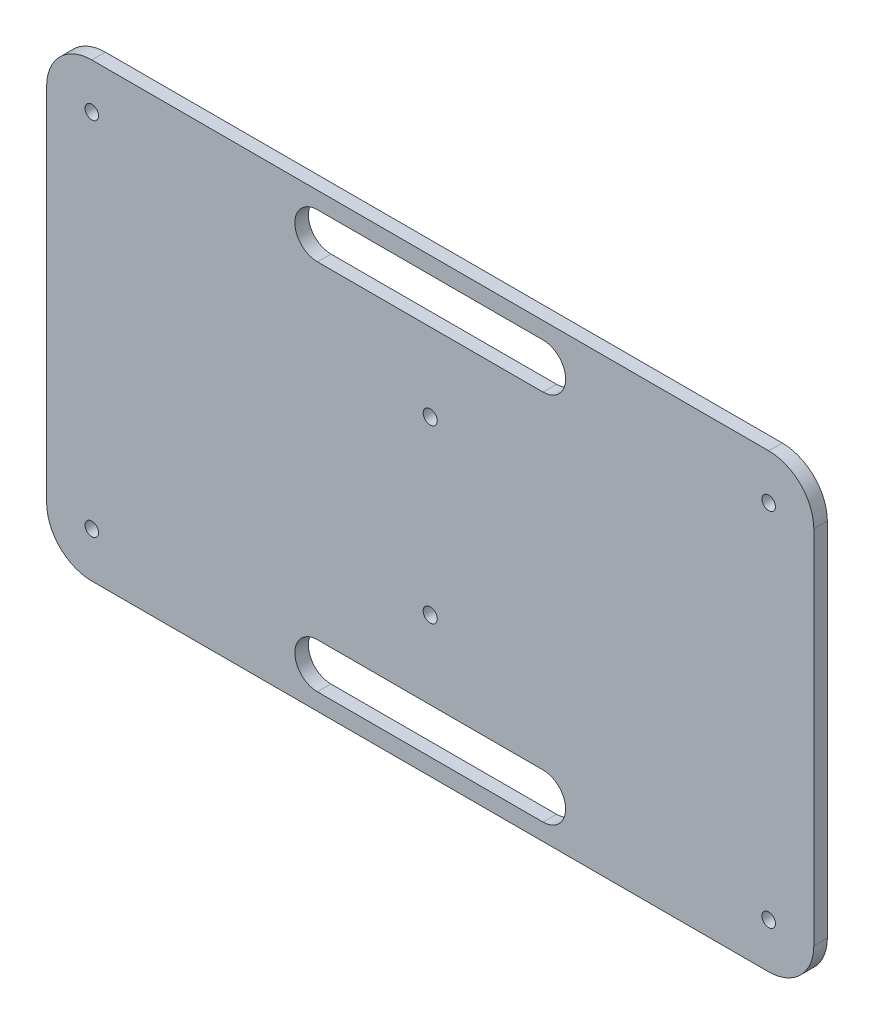
ISO-10303-21;
HEADER;
FILE_DESCRIPTION(('STEP AP214'),'2;1');
FILE_NAME('part.step','',(''),(''),'','','');
FILE_SCHEMA(('AUTOMOTIVE_DESIGN { 1 0 10303 214 1 1 1 1 }'));
ENDSEC;
DATA;
#1=APPLICATION_CONTEXT('core data for automotive mechanical design processes');
#2=APPLICATION_PROTOCOL_DEFINITION('international standard','automotive_design',2000,#1);
#3=PRODUCT_CONTEXT('',#1,'mechanical');
#4=PRODUCT('Part','Part','',(#3));
#5=PRODUCT_RELATED_PRODUCT_CATEGORY('part','',(#4));
#6=PRODUCT_DEFINITION_FORMATION('','',#4);
#7=PRODUCT_DEFINITION_CONTEXT('part definition',#1,'design');
#8=PRODUCT_DEFINITION('design','',#6,#7);
#9=PRODUCT_DEFINITION_SHAPE('','',#8);
#10=(LENGTH_UNIT() NAMED_UNIT(*) SI_UNIT(.MILLI.,.METRE.));
#11=(NAMED_UNIT(*) PLANE_ANGLE_UNIT() SI_UNIT($,.RADIAN.));
#12=(NAMED_UNIT(*) SI_UNIT($,.STERADIAN.) SOLID_ANGLE_UNIT());
#13=UNCERTAINTY_MEASURE_WITH_UNIT(LENGTH_MEASURE(1.E-05),#10,'distance_accuracy_value','');
#14=(GEOMETRIC_REPRESENTATION_CONTEXT(3) GLOBAL_UNCERTAINTY_ASSIGNED_CONTEXT((#13)) GLOBAL_UNIT_ASSIGNED_CONTEXT((#10,
#11,#12)) REPRESENTATION_CONTEXT('',''));
#15=CARTESIAN_POINT('',(0.,0.,0.));
#16=DIRECTION('',(0.,0.,1.));
#17=DIRECTION('',(1.,0.,0.));
#18=AXIS2_PLACEMENT_3D('',#15,#16,#17);
#19=CARTESIAN_POINT('',(75.,40.,3.));
#20=DIRECTION('',(0.,0.,-1.));
#21=DIRECTION('',(-1.,0.,0.));
#22=AXIS2_PLACEMENT_3D('',#19,#20,#21);
#23=PLANE('',#22);
#24=CARTESIAN_POINT('',(-25.,41.2578299056687,3.));
#25=DIRECTION('',(0.,0.,1.));
#26=DIRECTION('',(1.,0.,0.));
#27=AXIS2_PLACEMENT_3D('',#24,#25,#26);
#28=CIRCLE('',#27,5.00000000000002);
#29=CARTESIAN_POINT('',(-25.,46.2578299056687,3.));
#30=VERTEX_POINT('',#29);
#31=CARTESIAN_POINT('',(-25.,36.2578299056687,3.));
#32=VERTEX_POINT('',#31);
#33=EDGE_CURVE('E184',#30,#32,#28,.T.);
#34=ORIENTED_EDGE('',*,*,#33,.F.);
#35=DIRECTION('',(-1.,0.,0.));
#36=VECTOR('',#35,1.);
#37=CARTESIAN_POINT('',(-25.,46.2578299056687,3.));
#38=LINE('',#37,#36);
#39=CARTESIAN_POINT('',(25.,46.2578299056687,3.));
#40=VERTEX_POINT('',#39);
#41=EDGE_CURVE('E192',#40,#30,#38,.T.);
#42=ORIENTED_EDGE('',*,*,#41,.F.);
#43=CARTESIAN_POINT('',(25.,41.2578299056687,3.));
#44=DIRECTION('',(0.,0.,1.));
#45=DIRECTION('',(1.,0.,0.));
#46=AXIS2_PLACEMENT_3D('',#43,#44,#45);
#47=CIRCLE('',#46,5.00000000000002);
#48=CARTESIAN_POINT('',(25.,36.2578299056687,3.));
#49=VERTEX_POINT('',#48);
#50=EDGE_CURVE('E189',#49,#40,#47,.T.);
#51=ORIENTED_EDGE('',*,*,#50,.F.);
#52=DIRECTION('',(1.,0.,0.));
#53=VECTOR('',#52,1.);
#54=CARTESIAN_POINT('',(-25.,36.2578299056687,3.));
#55=LINE('',#54,#53);
#56=EDGE_CURVE('E186',#32,#49,#55,.T.);
#57=ORIENTED_EDGE('',*,*,#56,.F.);
#58=EDGE_LOOP('',(#34,#42,#51,#57));
#59=FACE_BOUND('',#58,.T.);
#60=CARTESIAN_POINT('',(75.,40.,3.));
#61=DIRECTION('',(0.,0.,1.));
#62=DIRECTION('',(-1.,0.,0.));
#63=AXIS2_PLACEMENT_3D('',#60,#61,#62);
#64=CIRCLE('',#63,10.);
#65=CARTESIAN_POINT('',(85.,39.9999999999999,3.));
#66=VERTEX_POINT('',#65);
#67=CARTESIAN_POINT('',(74.9999999999999,50.,3.));
#68=VERTEX_POINT('',#67);
#69=EDGE_CURVE('E215',#66,#68,#64,.T.);
#70=ORIENTED_EDGE('',*,*,#69,.T.);
#71=DIRECTION('',(-1.,0.,0.));
#72=VECTOR('',#71,1.);
#73=CARTESIAN_POINT('',(-74.9999999999999,50.,3.));
#74=LINE('',#73,#72);
#75=CARTESIAN_POINT('',(-74.9999999999999,50.,3.));
#76=VERTEX_POINT('',#75);
#77=EDGE_CURVE('E218',#68,#76,#74,.T.);
#78=ORIENTED_EDGE('',*,*,#77,.T.);
#79=CARTESIAN_POINT('',(-75.,40.,3.));
#80=DIRECTION('',(0.,0.,1.));
#81=DIRECTION('',(1.,0.,0.));
#82=AXIS2_PLACEMENT_3D('',#79,#80,#81);
#83=CIRCLE('',#82,10.);
#84=CARTESIAN_POINT('',(-85.,39.9999999999999,3.));
#85=VERTEX_POINT('',#84);
#86=EDGE_CURVE('E221',#76,#85,#83,.T.);
#87=ORIENTED_EDGE('',*,*,#86,.T.);
#88=DIRECTION('',(0.,-1.,0.));
#89=VECTOR('',#88,1.);
#90=CARTESIAN_POINT('',(-85.,39.9999999999999,3.));
#91=LINE('',#90,#89);
#92=CARTESIAN_POINT('',(-85.,-39.9999999999999,3.));
#93=VERTEX_POINT('',#92);
#94=EDGE_CURVE('E223',#85,#93,#91,.T.);
#95=ORIENTED_EDGE('',*,*,#94,.T.);
#96=CARTESIAN_POINT('',(-75.,-40.,3.));
#97=DIRECTION('',(0.,0.,1.));
#98=DIRECTION('',(-1.,0.,0.));
#99=AXIS2_PLACEMENT_3D('',#96,#97,#98);
#100=CIRCLE('',#99,10.);
#101=CARTESIAN_POINT('',(-74.9999999999999,-50.,3.));
#102=VERTEX_POINT('',#101);
#103=EDGE_CURVE('E225',#93,#102,#100,.T.);
#104=ORIENTED_EDGE('',*,*,#103,.T.);
#105=DIRECTION('',(1.,0.,0.));
#106=VECTOR('',#105,1.);
#107=CARTESIAN_POINT('',(-74.9999999999999,-50.,3.));
#108=LINE('',#107,#106);
#109=CARTESIAN_POINT('',(74.9999999999999,-50.,3.));
#110=VERTEX_POINT('',#109);
#111=EDGE_CURVE('E227',#102,#110,#108,.T.);
#112=ORIENTED_EDGE('',*,*,#111,.T.);
#113=CARTESIAN_POINT('',(75.,-40.,3.));
#114=DIRECTION('',(0.,0.,1.));
#115=DIRECTION('',(-1.,0.,0.));
#116=AXIS2_PLACEMENT_3D('',#113,#114,#115);
#117=CIRCLE('',#116,10.);
#118=CARTESIAN_POINT('',(85.,-39.9999999999999,3.));
#119=VERTEX_POINT('',#118);
#120=EDGE_CURVE('E229',#110,#119,#117,.T.);
#121=ORIENTED_EDGE('',*,*,#120,.T.);
#122=DIRECTION('',(0.,1.,0.));
#123=VECTOR('',#122,1.);
#124=CARTESIAN_POINT('',(85.,39.9999999999999,3.));
#125=LINE('',#124,#123);
#126=EDGE_CURVE('E231',#119,#66,#125,.T.);
#127=ORIENTED_EDGE('',*,*,#126,.T.);
#128=EDGE_LOOP('',(#70,#78,#87,#95,#104,#112,#121,#127));
#129=FACE_BOUND('',#128,.T.);
#130=CARTESIAN_POINT('',(-25.,-41.2578299056687,3.));
#131=DIRECTION('',(0.,0.,1.));
#132=DIRECTION('',(-1.,0.,0.));
#133=AXIS2_PLACEMENT_3D('',#130,#131,#132);
#134=CIRCLE('',#133,5.00000000000002);
#135=CARTESIAN_POINT('',(-25.,-36.2578299056687,3.));
#136=VERTEX_POINT('',#135);
#137=CARTESIAN_POINT('',(-25.,-46.2578299056687,3.));
#138=VERTEX_POINT('',#137);
#139=EDGE_CURVE('E145',#136,#138,#134,.T.);
#140=ORIENTED_EDGE('',*,*,#139,.F.);
#141=DIRECTION('',(-1.,0.,0.));
#142=VECTOR('',#141,1.);
#143=CARTESIAN_POINT('',(-25.,-36.2578299056687,3.));
#144=LINE('',#143,#142);
#145=CARTESIAN_POINT('',(25.,-36.2578299056687,3.));
#146=VERTEX_POINT('',#145);
#147=EDGE_CURVE('E168',#146,#136,#144,.T.);
#148=ORIENTED_EDGE('',*,*,#147,.F.);
#149=CARTESIAN_POINT('',(25.,-41.2578299056687,3.));
#150=DIRECTION('',(0.,0.,1.));
#151=DIRECTION('',(-1.,0.,0.));
#152=AXIS2_PLACEMENT_3D('',#149,#150,#151);
#153=CIRCLE('',#152,5.00000000000002);
#154=CARTESIAN_POINT('',(25.,-46.2578299056687,3.));
#155=VERTEX_POINT('',#154);
#156=EDGE_CURVE('E166',#155,#146,#153,.T.);
#157=ORIENTED_EDGE('',*,*,#156,.F.);
#158=DIRECTION('',(1.,0.,0.));
#159=VECTOR('',#158,1.);
#160=CARTESIAN_POINT('',(-25.,-46.2578299056687,3.));
#161=LINE('',#160,#159);
#162=EDGE_CURVE('E153',#138,#155,#161,.T.);
#163=ORIENTED_EDGE('',*,*,#162,.F.);
#164=EDGE_LOOP('',(#140,#148,#157,#163));
#165=FACE_BOUND('',#164,.T.);
#166=CARTESIAN_POINT('',(0.,19.,3.));
#167=DIRECTION('',(0.,0.,1.));
#168=DIRECTION('',(1.,0.,0.));
#169=AXIS2_PLACEMENT_3D('',#166,#167,#168);
#170=CIRCLE('',#169,1.56);
#171=CARTESIAN_POINT('',(1.55999999999999,19.,3.));
#172=VERTEX_POINT('',#171);
#173=EDGE_CURVE('E174',#172,#172,#170,.T.);
#174=ORIENTED_EDGE('',*,*,#173,.F.);
#175=EDGE_LOOP('',(#174));
#176=FACE_BOUND('',#175,.T.);
#177=CARTESIAN_POINT('',(0.,-19.,3.));
#178=DIRECTION('',(0.,0.,1.));
#179=DIRECTION('',(1.,0.,0.));
#180=AXIS2_PLACEMENT_3D('',#177,#178,#179);
#181=CIRCLE('',#180,1.56);
#182=CARTESIAN_POINT('',(1.56000000000001,-19.,3.));
#183=VERTEX_POINT('',#182);
#184=EDGE_CURVE('E424',#183,#183,#181,.T.);
#185=ORIENTED_EDGE('',*,*,#184,.F.);
#186=EDGE_LOOP('',(#185));
#187=FACE_BOUND('',#186,.T.);
#188=CARTESIAN_POINT('',(-75.,40.,3.));
#189=DIRECTION('',(0.,0.,1.));
#190=DIRECTION('',(1.,0.,0.));
#191=AXIS2_PLACEMENT_3D('',#188,#189,#190);
#192=CIRCLE('',#191,1.5);
#193=CARTESIAN_POINT('',(-73.5,40.,3.));
#194=VERTEX_POINT('',#193);
#195=EDGE_CURVE('E418',#194,#194,#192,.T.);
#196=ORIENTED_EDGE('',*,*,#195,.F.);
#197=EDGE_LOOP('',(#196));
#198=FACE_BOUND('',#197,.T.);
#199=CARTESIAN_POINT('',(75.,40.,3.));
#200=DIRECTION('',(0.,0.,1.));
#201=DIRECTION('',(1.,0.,0.));
#202=AXIS2_PLACEMENT_3D('',#199,#200,#201);
#203=CIRCLE('',#202,1.5);
#204=CARTESIAN_POINT('',(76.5,40.,3.));
#205=VERTEX_POINT('',#204);
#206=EDGE_CURVE('E412',#205,#205,#203,.T.);
#207=ORIENTED_EDGE('',*,*,#206,.F.);
#208=EDGE_LOOP('',(#207));
#209=FACE_BOUND('',#208,.T.);
#210=CARTESIAN_POINT('',(75.,-40.,3.));
#211=DIRECTION('',(0.,0.,1.));
#212=DIRECTION('',(1.,0.,0.));
#213=AXIS2_PLACEMENT_3D('',#210,#211,#212);
#214=CIRCLE('',#213,1.5);
#215=CARTESIAN_POINT('',(76.5,-40.,3.));
#216=VERTEX_POINT('',#215);
#217=EDGE_CURVE('E406',#216,#216,#214,.T.);
#218=ORIENTED_EDGE('',*,*,#217,.F.);
#219=EDGE_LOOP('',(#218));
#220=FACE_BOUND('',#219,.T.);
#221=CARTESIAN_POINT('',(-75.,-40.,3.));
#222=DIRECTION('',(0.,0.,1.));
#223=DIRECTION('',(1.,0.,0.));
#224=AXIS2_PLACEMENT_3D('',#221,#222,#223);
#225=CIRCLE('',#224,1.5);
#226=CARTESIAN_POINT('',(-73.5,-40.,3.));
#227=VERTEX_POINT('',#226);
#228=EDGE_CURVE('E397',#227,#227,#225,.T.);
#229=ORIENTED_EDGE('',*,*,#228,.F.);
#230=EDGE_LOOP('',(#229));
#231=FACE_BOUND('',#230,.T.);
#232=ADVANCED_FACE('F32',(#59,#129,#165,#176,#187,#198,#209,#220,#231),#23,.F.);
#233=CARTESIAN_POINT('',(75.,40.,0.));
#234=DIRECTION('',(0.,0.,-1.));
#235=DIRECTION('',(-1.,0.,0.));
#236=AXIS2_PLACEMENT_3D('',#233,#234,#235);
#237=PLANE('',#236);
#238=CARTESIAN_POINT('',(75.,-40.,0.));
#239=DIRECTION('',(0.,0.,1.));
#240=DIRECTION('',(1.,0.,0.));
#241=AXIS2_PLACEMENT_3D('',#238,#239,#240);
#242=CIRCLE('',#241,1.5);
#243=CARTESIAN_POINT('',(76.5,-40.,0.));
#244=VERTEX_POINT('',#243);
#245=EDGE_CURVE('E403',#244,#244,#242,.T.);
#246=ORIENTED_EDGE('',*,*,#245,.T.);
#247=EDGE_LOOP('',(#246));
#248=FACE_BOUND('',#247,.T.);
#249=CARTESIAN_POINT('',(-75.,40.,0.));
#250=DIRECTION('',(0.,0.,1.));
#251=DIRECTION('',(1.,0.,0.));
#252=AXIS2_PLACEMENT_3D('',#249,#250,#251);
#253=CIRCLE('',#252,1.5);
#254=CARTESIAN_POINT('',(-73.5,40.,0.));
#255=VERTEX_POINT('',#254);
#256=EDGE_CURVE('E415',#255,#255,#253,.T.);
#257=ORIENTED_EDGE('',*,*,#256,.T.);
#258=EDGE_LOOP('',(#257));
#259=FACE_BOUND('',#258,.T.);
#260=CARTESIAN_POINT('',(0.,19.,0.));
#261=DIRECTION('',(0.,0.,1.));
#262=DIRECTION('',(1.,0.,0.));
#263=AXIS2_PLACEMENT_3D('',#260,#261,#262);
#264=CIRCLE('',#263,1.56);
#265=CARTESIAN_POINT('',(1.55999999999999,19.,0.));
#266=VERTEX_POINT('',#265);
#267=EDGE_CURVE('E427',#266,#266,#264,.T.);
#268=ORIENTED_EDGE('',*,*,#267,.T.);
#269=EDGE_LOOP('',(#268));
#270=FACE_BOUND('',#269,.T.);
#271=CARTESIAN_POINT('',(75.,40.,0.));
#272=DIRECTION('',(0.,0.,1.));
#273=DIRECTION('',(-1.,0.,0.));
#274=AXIS2_PLACEMENT_3D('',#271,#272,#273);
#275=CIRCLE('',#274,10.);
#276=CARTESIAN_POINT('',(85.,39.9999999999999,0.));
#277=VERTEX_POINT('',#276);
#278=CARTESIAN_POINT('',(74.9999999999999,50.,0.));
#279=VERTEX_POINT('',#278);
#280=EDGE_CURVE('E214',#277,#279,#275,.T.);
#281=ORIENTED_EDGE('',*,*,#280,.F.);
#282=DIRECTION('',(0.,1.,0.));
#283=VECTOR('',#282,1.);
#284=CARTESIAN_POINT('',(85.,39.9999999999999,0.));
#285=LINE('',#284,#283);
#286=CARTESIAN_POINT('',(85.,-39.9999999999999,0.));
#287=VERTEX_POINT('',#286);
#288=EDGE_CURVE('E219',#287,#277,#285,.T.);
#289=ORIENTED_EDGE('',*,*,#288,.F.);
#290=CARTESIAN_POINT('',(75.,-40.,0.));
#291=DIRECTION('',(0.,0.,1.));
#292=DIRECTION('',(-1.,0.,0.));
#293=AXIS2_PLACEMENT_3D('',#290,#291,#292);
#294=CIRCLE('',#293,10.);
#295=CARTESIAN_POINT('',(74.9999999999999,-50.,0.));
#296=VERTEX_POINT('',#295);
#297=EDGE_CURVE('E246',#296,#287,#294,.T.);
#298=ORIENTED_EDGE('',*,*,#297,.F.);
#299=DIRECTION('',(1.,0.,0.));
#300=VECTOR('',#299,1.);
#301=CARTESIAN_POINT('',(-74.9999999999999,-50.,0.));
#302=LINE('',#301,#300);
#303=CARTESIAN_POINT('',(-74.9999999999999,-50.,0.));
#304=VERTEX_POINT('',#303);
#305=EDGE_CURVE('E244',#304,#296,#302,.T.);
#306=ORIENTED_EDGE('',*,*,#305,.F.);
#307=CARTESIAN_POINT('',(-75.,-40.,0.));
#308=DIRECTION('',(0.,0.,1.));
#309=DIRECTION('',(-1.,0.,0.));
#310=AXIS2_PLACEMENT_3D('',#307,#308,#309);
#311=CIRCLE('',#310,10.);
#312=CARTESIAN_POINT('',(-85.,-39.9999999999999,0.));
#313=VERTEX_POINT('',#312);
#314=EDGE_CURVE('E242',#313,#304,#311,.T.);
#315=ORIENTED_EDGE('',*,*,#314,.F.);
#316=DIRECTION('',(0.,-1.,0.));
#317=VECTOR('',#316,1.);
#318=CARTESIAN_POINT('',(-85.,39.9999999999999,0.));
#319=LINE('',#318,#317);
#320=CARTESIAN_POINT('',(-85.,39.9999999999999,0.));
#321=VERTEX_POINT('',#320);
#322=EDGE_CURVE('E240',#321,#313,#319,.T.);
#323=ORIENTED_EDGE('',*,*,#322,.F.);
#324=CARTESIAN_POINT('',(-75.,40.,0.));
#325=DIRECTION('',(0.,0.,1.));
#326=DIRECTION('',(1.,0.,0.));
#327=AXIS2_PLACEMENT_3D('',#324,#325,#326);
#328=CIRCLE('',#327,10.);
#329=CARTESIAN_POINT('',(-74.9999999999999,50.,0.));
#330=VERTEX_POINT('',#329);
#331=EDGE_CURVE('E238',#330,#321,#328,.T.);
#332=ORIENTED_EDGE('',*,*,#331,.F.);
#333=DIRECTION('',(-1.,0.,0.));
#334=VECTOR('',#333,1.);
#335=CARTESIAN_POINT('',(-74.9999999999999,50.,0.));
#336=LINE('',#335,#334);
#337=EDGE_CURVE('E236',#279,#330,#336,.T.);
#338=ORIENTED_EDGE('',*,*,#337,.F.);
#339=EDGE_LOOP('',(#281,#289,#298,#306,#315,#323,#332,#338));
#340=FACE_BOUND('',#339,.T.);
#341=DIRECTION('',(-1.,0.,0.));
#342=VECTOR('',#341,1.);
#343=CARTESIAN_POINT('',(-25.,46.2578299056687,0.));
#344=LINE('',#343,#342);
#345=CARTESIAN_POINT('',(25.,46.2578299056687,0.));
#346=VERTEX_POINT('',#345);
#347=CARTESIAN_POINT('',(-25.,46.2578299056687,0.));
#348=VERTEX_POINT('',#347);
#349=EDGE_CURVE('E187',#346,#348,#344,.T.);
#350=ORIENTED_EDGE('',*,*,#349,.T.);
#351=CARTESIAN_POINT('',(-25.,41.2578299056687,0.));
#352=DIRECTION('',(0.,0.,1.));
#353=DIRECTION('',(1.,0.,0.));
#354=AXIS2_PLACEMENT_3D('',#351,#352,#353);
#355=CIRCLE('',#354,5.00000000000002);
#356=CARTESIAN_POINT('',(-25.,36.2578299056687,0.));
#357=VERTEX_POINT('',#356);
#358=EDGE_CURVE('E161',#348,#357,#355,.T.);
#359=ORIENTED_EDGE('',*,*,#358,.T.);
#360=DIRECTION('',(1.,0.,0.));
#361=VECTOR('',#360,1.);
#362=CARTESIAN_POINT('',(-25.,36.2578299056687,0.));
#363=LINE('',#362,#361);
#364=CARTESIAN_POINT('',(25.,36.2578299056687,0.));
#365=VERTEX_POINT('',#364);
#366=EDGE_CURVE('E197',#357,#365,#363,.T.);
#367=ORIENTED_EDGE('',*,*,#366,.T.);
#368=CARTESIAN_POINT('',(25.,41.2578299056687,0.));
#369=DIRECTION('',(0.,0.,1.));
#370=DIRECTION('',(1.,0.,0.));
#371=AXIS2_PLACEMENT_3D('',#368,#369,#370);
#372=CIRCLE('',#371,5.00000000000002);
#373=EDGE_CURVE('E200',#365,#346,#372,.T.);
#374=ORIENTED_EDGE('',*,*,#373,.T.);
#375=EDGE_LOOP('',(#350,#359,#367,#374));
#376=FACE_BOUND('',#375,.T.);
#377=DIRECTION('',(-1.,0.,0.));
#378=VECTOR('',#377,1.);
#379=CARTESIAN_POINT('',(-25.,-36.2578299056687,0.));
#380=LINE('',#379,#378);
#381=CARTESIAN_POINT('',(25.,-36.2578299056687,0.));
#382=VERTEX_POINT('',#381);
#383=CARTESIAN_POINT('',(-25.,-36.2578299056687,0.));
#384=VERTEX_POINT('',#383);
#385=EDGE_CURVE('E154',#382,#384,#380,.T.);
#386=ORIENTED_EDGE('',*,*,#385,.T.);
#387=CARTESIAN_POINT('',(-25.,-41.2578299056687,0.));
#388=DIRECTION('',(0.,0.,1.));
#389=DIRECTION('',(-1.,0.,0.));
#390=AXIS2_PLACEMENT_3D('',#387,#388,#389);
#391=CIRCLE('',#390,5.00000000000002);
#392=CARTESIAN_POINT('',(-25.,-46.2578299056687,0.));
#393=VERTEX_POINT('',#392);
#394=EDGE_CURVE('E55',#384,#393,#391,.T.);
#395=ORIENTED_EDGE('',*,*,#394,.T.);
#396=DIRECTION('',(1.,0.,0.));
#397=VECTOR('',#396,1.);
#398=CARTESIAN_POINT('',(-25.,-46.2578299056687,0.));
#399=LINE('',#398,#397);
#400=CARTESIAN_POINT('',(25.,-46.2578299056687,0.));
#401=VERTEX_POINT('',#400);
#402=EDGE_CURVE('E160',#393,#401,#399,.T.);
#403=ORIENTED_EDGE('',*,*,#402,.T.);
#404=CARTESIAN_POINT('',(25.,-41.2578299056687,0.));
#405=DIRECTION('',(0.,0.,1.));
#406=DIRECTION('',(-1.,0.,0.));
#407=AXIS2_PLACEMENT_3D('',#404,#405,#406);
#408=CIRCLE('',#407,5.00000000000002);
#409=EDGE_CURVE('E176',#401,#382,#408,.T.);
#410=ORIENTED_EDGE('',*,*,#409,.T.);
#411=EDGE_LOOP('',(#386,#395,#403,#410));
#412=FACE_BOUND('',#411,.T.);
#413=CARTESIAN_POINT('',(0.,-19.,0.));
#414=DIRECTION('',(0.,0.,1.));
#415=DIRECTION('',(1.,0.,0.));
#416=AXIS2_PLACEMENT_3D('',#413,#414,#415);
#417=CIRCLE('',#416,1.56);
#418=CARTESIAN_POINT('',(1.56000000000001,-19.,0.));
#419=VERTEX_POINT('',#418);
#420=EDGE_CURVE('E421',#419,#419,#417,.T.);
#421=ORIENTED_EDGE('',*,*,#420,.T.);
#422=EDGE_LOOP('',(#421));
#423=FACE_BOUND('',#422,.T.);
#424=CARTESIAN_POINT('',(75.,40.,0.));
#425=DIRECTION('',(0.,0.,1.));
#426=DIRECTION('',(1.,0.,0.));
#427=AXIS2_PLACEMENT_3D('',#424,#425,#426);
#428=CIRCLE('',#427,1.5);
#429=CARTESIAN_POINT('',(76.5,40.,0.));
#430=VERTEX_POINT('',#429);
#431=EDGE_CURVE('E409',#430,#430,#428,.T.);
#432=ORIENTED_EDGE('',*,*,#431,.T.);
#433=EDGE_LOOP('',(#432));
#434=FACE_BOUND('',#433,.T.);
#435=CARTESIAN_POINT('',(-75.,-40.,0.));
#436=DIRECTION('',(0.,0.,1.));
#437=DIRECTION('',(1.,0.,0.));
#438=AXIS2_PLACEMENT_3D('',#435,#436,#437);
#439=CIRCLE('',#438,1.5);
#440=CARTESIAN_POINT('',(-73.5,-40.,0.));
#441=VERTEX_POINT('',#440);
#442=EDGE_CURVE('E400',#441,#441,#439,.T.);
#443=ORIENTED_EDGE('',*,*,#442,.T.);
#444=EDGE_LOOP('',(#443));
#445=FACE_BOUND('',#444,.T.);
#446=ADVANCED_FACE('F276',(#248,#259,#270,#340,#376,#412,#423,#434,#445),#237,.T.);
#447=CARTESIAN_POINT('',(75.,40.,3.));
#448=DIRECTION('',(0.,0.,-1.));
#449=DIRECTION('',(-1.,0.,0.));
#450=AXIS2_PLACEMENT_3D('',#447,#448,#449);
#451=CYLINDRICAL_SURFACE('',#450,10.);
#452=ORIENTED_EDGE('',*,*,#280,.T.);
#453=DIRECTION('',(0.,0.,-1.));
#454=VECTOR('',#453,1.);
#455=CARTESIAN_POINT('',(74.9999999999999,50.,3.));
#456=LINE('',#455,#454);
#457=EDGE_CURVE('E11',#68,#279,#456,.T.);
#458=ORIENTED_EDGE('',*,*,#457,.F.);
#459=ORIENTED_EDGE('',*,*,#69,.F.);
#460=DIRECTION('',(0.,0.,-1.));
#461=VECTOR('',#460,1.);
#462=CARTESIAN_POINT('',(85.,39.9999999999999,3.));
#463=LINE('',#462,#461);
#464=EDGE_CURVE('E233',#66,#277,#463,.T.);
#465=ORIENTED_EDGE('',*,*,#464,.T.);
#466=EDGE_LOOP('',(#452,#458,#459,#465));
#467=FACE_BOUND('',#466,.T.);
#468=ADVANCED_FACE('F34',(#467),#451,.T.);
#469=CARTESIAN_POINT('',(-74.9999999999999,50.,3.));
#470=DIRECTION('',(0.,-1.,0.));
#471=DIRECTION('',(0.,0.,-1.));
#472=AXIS2_PLACEMENT_3D('',#469,#470,#471);
#473=PLANE('',#472);
#474=ORIENTED_EDGE('',*,*,#337,.T.);
#475=DIRECTION('',(0.,0.,-1.));
#476=VECTOR('',#475,1.);
#477=CARTESIAN_POINT('',(-74.9999999999999,50.,3.));
#478=LINE('',#477,#476);
#479=EDGE_CURVE('E40',#76,#330,#478,.T.);
#480=ORIENTED_EDGE('',*,*,#479,.F.);
#481=ORIENTED_EDGE('',*,*,#77,.F.);
#482=ORIENTED_EDGE('',*,*,#457,.T.);
#483=EDGE_LOOP('',(#474,#480,#481,#482));
#484=FACE_BOUND('',#483,.T.);
#485=ADVANCED_FACE('F293',(#484),#473,.F.);
#486=CARTESIAN_POINT('',(-75.,40.,3.));
#487=DIRECTION('',(0.,0.,-1.));
#488=DIRECTION('',(-1.,0.,0.));
#489=AXIS2_PLACEMENT_3D('',#486,#487,#488);
#490=CYLINDRICAL_SURFACE('',#489,10.);
#491=ORIENTED_EDGE('',*,*,#331,.T.);
#492=DIRECTION('',(0.,0.,-1.));
#493=VECTOR('',#492,1.);
#494=CARTESIAN_POINT('',(-85.,39.9999999999999,3.));
#495=LINE('',#494,#493);
#496=EDGE_CURVE('E263',#85,#321,#495,.T.);
#497=ORIENTED_EDGE('',*,*,#496,.F.);
#498=ORIENTED_EDGE('',*,*,#86,.F.);
#499=ORIENTED_EDGE('',*,*,#479,.T.);
#500=EDGE_LOOP('',(#491,#497,#498,#499));
#501=FACE_BOUND('',#500,.T.);
#502=ADVANCED_FACE('F270',(#501),#490,.T.);
#503=CARTESIAN_POINT('',(-85.,39.9999999999999,3.));
#504=DIRECTION('',(1.,0.,0.));
#505=DIRECTION('',(0.,1.,0.));
#506=AXIS2_PLACEMENT_3D('',#503,#504,#505);
#507=PLANE('',#506);
#508=ORIENTED_EDGE('',*,*,#322,.T.);
#509=DIRECTION('',(0.,0.,-1.));
#510=VECTOR('',#509,1.);
#511=CARTESIAN_POINT('',(-85.,-39.9999999999999,3.));
#512=LINE('',#511,#510);
#513=EDGE_CURVE('E260',#93,#313,#512,.T.);
#514=ORIENTED_EDGE('',*,*,#513,.F.);
#515=ORIENTED_EDGE('',*,*,#94,.F.);
#516=ORIENTED_EDGE('',*,*,#496,.T.);
#517=EDGE_LOOP('',(#508,#514,#515,#516));
#518=FACE_BOUND('',#517,.T.);
#519=ADVANCED_FACE('F282',(#518),#507,.F.);
#520=CARTESIAN_POINT('',(-75.,-40.,3.));
#521=DIRECTION('',(0.,0.,-1.));
#522=DIRECTION('',(-1.,0.,0.));
#523=AXIS2_PLACEMENT_3D('',#520,#521,#522);
#524=CYLINDRICAL_SURFACE('',#523,10.);
#525=ORIENTED_EDGE('',*,*,#314,.T.);
#526=DIRECTION('',(0.,0.,-1.));
#527=VECTOR('',#526,1.);
#528=CARTESIAN_POINT('',(-74.9999999999999,-50.,3.));
#529=LINE('',#528,#527);
#530=EDGE_CURVE('E257',#102,#304,#529,.T.);
#531=ORIENTED_EDGE('',*,*,#530,.F.);
#532=ORIENTED_EDGE('',*,*,#103,.F.);
#533=ORIENTED_EDGE('',*,*,#513,.T.);
#534=EDGE_LOOP('',(#525,#531,#532,#533));
#535=FACE_BOUND('',#534,.T.);
#536=ADVANCED_FACE('F286',(#535),#524,.T.);
#537=CARTESIAN_POINT('',(-74.9999999999999,-50.,3.));
#538=DIRECTION('',(0.,1.,0.));
#539=DIRECTION('',(0.,0.,1.));
#540=AXIS2_PLACEMENT_3D('',#537,#538,#539);
#541=PLANE('',#540);
#542=ORIENTED_EDGE('',*,*,#305,.T.);
#543=DIRECTION('',(0.,0.,-1.));
#544=VECTOR('',#543,1.);
#545=CARTESIAN_POINT('',(74.9999999999999,-50.,3.));
#546=LINE('',#545,#544);
#547=EDGE_CURVE('E254',#110,#296,#546,.T.);
#548=ORIENTED_EDGE('',*,*,#547,.F.);
#549=ORIENTED_EDGE('',*,*,#111,.F.);
#550=ORIENTED_EDGE('',*,*,#530,.T.);
#551=EDGE_LOOP('',(#542,#548,#549,#550));
#552=FACE_BOUND('',#551,.T.);
#553=ADVANCED_FACE('F306',(#552),#541,.F.);
#554=CARTESIAN_POINT('',(75.,-40.,3.));
#555=DIRECTION('',(0.,0.,-1.));
#556=DIRECTION('',(-1.,0.,0.));
#557=AXIS2_PLACEMENT_3D('',#554,#555,#556);
#558=CYLINDRICAL_SURFACE('',#557,10.);
#559=ORIENTED_EDGE('',*,*,#297,.T.);
#560=DIRECTION('',(0.,0.,-1.));
#561=VECTOR('',#560,1.);
#562=CARTESIAN_POINT('',(85.,-39.9999999999999,3.));
#563=LINE('',#562,#561);
#564=EDGE_CURVE('E251',#119,#287,#563,.T.);
#565=ORIENTED_EDGE('',*,*,#564,.F.);
#566=ORIENTED_EDGE('',*,*,#120,.F.);
#567=ORIENTED_EDGE('',*,*,#547,.T.);
#568=EDGE_LOOP('',(#559,#565,#566,#567));
#569=FACE_BOUND('',#568,.T.);
#570=ADVANCED_FACE('F304',(#569),#558,.T.);
#571=CARTESIAN_POINT('',(85.,39.9999999999999,3.));
#572=DIRECTION('',(-1.,0.,0.));
#573=DIRECTION('',(0.,0.,1.));
#574=AXIS2_PLACEMENT_3D('',#571,#572,#573);
#575=PLANE('',#574);
#576=ORIENTED_EDGE('',*,*,#288,.T.);
#577=ORIENTED_EDGE('',*,*,#464,.F.);
#578=ORIENTED_EDGE('',*,*,#126,.F.);
#579=ORIENTED_EDGE('',*,*,#564,.T.);
#580=EDGE_LOOP('',(#576,#577,#578,#579));
#581=FACE_BOUND('',#580,.T.);
#582=ADVANCED_FACE('F299',(#581),#575,.F.);
#583=CARTESIAN_POINT('',(-25.,41.2578299056687,3.));
#584=DIRECTION('',(0.,0.,-1.));
#585=DIRECTION('',(-1.,0.,0.));
#586=AXIS2_PLACEMENT_3D('',#583,#584,#585);
#587=CYLINDRICAL_SURFACE('',#586,5.00000000000002);
#588=ORIENTED_EDGE('',*,*,#358,.F.);
#589=DIRECTION('',(0.,0.,-1.));
#590=VECTOR('',#589,1.);
#591=CARTESIAN_POINT('',(-25.,46.2578299056687,3.));
#592=LINE('',#591,#590);
#593=EDGE_CURVE('E194',#30,#348,#592,.T.);
#594=ORIENTED_EDGE('',*,*,#593,.F.);
#595=ORIENTED_EDGE('',*,*,#33,.T.);
#596=DIRECTION('',(0.,0.,-1.));
#597=VECTOR('',#596,1.);
#598=CARTESIAN_POINT('',(-25.,36.2578299056687,3.));
#599=LINE('',#598,#597);
#600=EDGE_CURVE('E211',#32,#357,#599,.T.);
#601=ORIENTED_EDGE('',*,*,#600,.T.);
#602=EDGE_LOOP('',(#588,#594,#595,#601));
#603=FACE_BOUND('',#602,.T.);
#604=ADVANCED_FACE('F325',(#603),#587,.F.);
#605=CARTESIAN_POINT('',(-25.,36.2578299056687,3.));
#606=DIRECTION('',(0.,1.,0.));
#607=DIRECTION('',(-1.,0.,0.));
#608=AXIS2_PLACEMENT_3D('',#605,#606,#607);
#609=PLANE('',#608);
#610=ORIENTED_EDGE('',*,*,#366,.F.);
#611=ORIENTED_EDGE('',*,*,#600,.F.);
#612=ORIENTED_EDGE('',*,*,#56,.T.);
#613=DIRECTION('',(0.,0.,-1.));
#614=VECTOR('',#613,1.);
#615=CARTESIAN_POINT('',(25.,36.2578299056687,3.));
#616=LINE('',#615,#614);
#617=EDGE_CURVE('E209',#49,#365,#616,.T.);
#618=ORIENTED_EDGE('',*,*,#617,.T.);
#619=EDGE_LOOP('',(#610,#611,#612,#618));
#620=FACE_BOUND('',#619,.T.);
#621=ADVANCED_FACE('F332',(#620),#609,.T.);
#622=CARTESIAN_POINT('',(25.,41.2578299056687,3.));
#623=DIRECTION('',(0.,0.,-1.));
#624=DIRECTION('',(-1.,0.,0.));
#625=AXIS2_PLACEMENT_3D('',#622,#623,#624);
#626=CYLINDRICAL_SURFACE('',#625,5.00000000000002);
#627=ORIENTED_EDGE('',*,*,#373,.F.);
#628=ORIENTED_EDGE('',*,*,#617,.F.);
#629=ORIENTED_EDGE('',*,*,#50,.T.);
#630=DIRECTION('',(0.,0.,-1.));
#631=VECTOR('',#630,1.);
#632=CARTESIAN_POINT('',(25.,46.2578299056687,3.));
#633=LINE('',#632,#631);
#634=EDGE_CURVE('E207',#40,#346,#633,.T.);
#635=ORIENTED_EDGE('',*,*,#634,.T.);
#636=EDGE_LOOP('',(#627,#628,#629,#635));
#637=FACE_BOUND('',#636,.T.);
#638=ADVANCED_FACE('F337',(#637),#626,.F.);
#639=CARTESIAN_POINT('',(-25.,46.2578299056687,3.));
#640=DIRECTION('',(0.,-1.,0.));
#641=DIRECTION('',(1.,0.,0.));
#642=AXIS2_PLACEMENT_3D('',#639,#640,#641);
#643=PLANE('',#642);
#644=ORIENTED_EDGE('',*,*,#349,.F.);
#645=ORIENTED_EDGE('',*,*,#634,.F.);
#646=ORIENTED_EDGE('',*,*,#41,.T.);
#647=ORIENTED_EDGE('',*,*,#593,.T.);
#648=EDGE_LOOP('',(#644,#645,#646,#647));
#649=FACE_BOUND('',#648,.T.);
#650=ADVANCED_FACE('F343',(#649),#643,.T.);
#651=CARTESIAN_POINT('',(-25.,-41.2578299056687,3.));
#652=DIRECTION('',(0.,0.,-1.));
#653=DIRECTION('',(-1.,0.,0.));
#654=AXIS2_PLACEMENT_3D('',#651,#652,#653);
#655=CYLINDRICAL_SURFACE('',#654,5.00000000000002);
#656=ORIENTED_EDGE('',*,*,#394,.F.);
#657=DIRECTION('',(0.,0.,-1.));
#658=VECTOR('',#657,1.);
#659=CARTESIAN_POINT('',(-25.,-36.2578299056687,3.));
#660=LINE('',#659,#658);
#661=EDGE_CURVE('E149',#136,#384,#660,.T.);
#662=ORIENTED_EDGE('',*,*,#661,.F.);
#663=ORIENTED_EDGE('',*,*,#139,.T.);
#664=DIRECTION('',(0.,0.,-1.));
#665=VECTOR('',#664,1.);
#666=CARTESIAN_POINT('',(-25.,-46.2578299056687,3.));
#667=LINE('',#666,#665);
#668=EDGE_CURVE('E148',#138,#393,#667,.T.);
#669=ORIENTED_EDGE('',*,*,#668,.T.);
#670=EDGE_LOOP('',(#656,#662,#663,#669));
#671=FACE_BOUND('',#670,.T.);
#672=ADVANCED_FACE('F147',(#671),#655,.F.);
#673=CARTESIAN_POINT('',(-25.,-46.2578299056687,3.));
#674=DIRECTION('',(0.,1.,0.));
#675=DIRECTION('',(-1.,0.,0.));
#676=AXIS2_PLACEMENT_3D('',#673,#674,#675);
#677=PLANE('',#676);
#678=ORIENTED_EDGE('',*,*,#402,.F.);
#679=ORIENTED_EDGE('',*,*,#668,.F.);
#680=ORIENTED_EDGE('',*,*,#162,.T.);
#681=DIRECTION('',(0.,0.,-1.));
#682=VECTOR('',#681,1.);
#683=CARTESIAN_POINT('',(25.,-46.2578299056687,3.));
#684=LINE('',#683,#682);
#685=EDGE_CURVE('E162',#155,#401,#684,.T.);
#686=ORIENTED_EDGE('',*,*,#685,.T.);
#687=EDGE_LOOP('',(#678,#679,#680,#686));
#688=FACE_BOUND('',#687,.T.);
#689=ADVANCED_FACE('F157',(#688),#677,.T.);
#690=CARTESIAN_POINT('',(25.,-41.2578299056687,3.));
#691=DIRECTION('',(0.,0.,-1.));
#692=DIRECTION('',(-1.,0.,0.));
#693=AXIS2_PLACEMENT_3D('',#690,#691,#692);
#694=CYLINDRICAL_SURFACE('',#693,5.00000000000002);
#695=ORIENTED_EDGE('',*,*,#409,.F.);
#696=ORIENTED_EDGE('',*,*,#685,.F.);
#697=ORIENTED_EDGE('',*,*,#156,.T.);
#698=DIRECTION('',(0.,0.,-1.));
#699=VECTOR('',#698,1.);
#700=CARTESIAN_POINT('',(25.,-36.2578299056687,3.));
#701=LINE('',#700,#699);
#702=EDGE_CURVE('E47',#146,#382,#701,.T.);
#703=ORIENTED_EDGE('',*,*,#702,.T.);
#704=EDGE_LOOP('',(#695,#696,#697,#703));
#705=FACE_BOUND('',#704,.T.);
#706=ADVANCED_FACE('F362',(#705),#694,.F.);
#707=CARTESIAN_POINT('',(-25.,-36.2578299056687,3.));
#708=DIRECTION('',(0.,-1.,0.));
#709=DIRECTION('',(1.,0.,0.));
#710=AXIS2_PLACEMENT_3D('',#707,#708,#709);
#711=PLANE('',#710);
#712=ORIENTED_EDGE('',*,*,#385,.F.);
#713=ORIENTED_EDGE('',*,*,#702,.F.);
#714=ORIENTED_EDGE('',*,*,#147,.T.);
#715=ORIENTED_EDGE('',*,*,#661,.T.);
#716=EDGE_LOOP('',(#712,#713,#714,#715));
#717=FACE_BOUND('',#716,.T.);
#718=ADVANCED_FACE('F365',(#717),#711,.T.);
#719=CARTESIAN_POINT('',(0.,19.,3.));
#720=DIRECTION('',(0.,0.,-1.));
#721=DIRECTION('',(-1.,0.,0.));
#722=AXIS2_PLACEMENT_3D('',#719,#720,#721);
#723=CYLINDRICAL_SURFACE('',#722,1.56);
#724=ORIENTED_EDGE('',*,*,#173,.T.);
#725=EDGE_LOOP('',(#724));
#726=FACE_BOUND('',#725,.T.);
#727=ORIENTED_EDGE('',*,*,#267,.F.);
#728=EDGE_LOOP('',(#727));
#729=FACE_BOUND('',#728,.T.);
#730=ADVANCED_FACE('F369',(#726,#729),#723,.F.);
#731=CARTESIAN_POINT('',(0.,-19.,3.));
#732=DIRECTION('',(0.,0.,-1.));
#733=DIRECTION('',(-1.,0.,0.));
#734=AXIS2_PLACEMENT_3D('',#731,#732,#733);
#735=CYLINDRICAL_SURFACE('',#734,1.56);
#736=ORIENTED_EDGE('',*,*,#184,.T.);
#737=EDGE_LOOP('',(#736));
#738=FACE_BOUND('',#737,.T.);
#739=ORIENTED_EDGE('',*,*,#420,.F.);
#740=EDGE_LOOP('',(#739));
#741=FACE_BOUND('',#740,.T.);
#742=ADVANCED_FACE('F372',(#738,#741),#735,.F.);
#743=CARTESIAN_POINT('',(-75.,40.,3.));
#744=DIRECTION('',(0.,0.,-1.));
#745=DIRECTION('',(-1.,0.,0.));
#746=AXIS2_PLACEMENT_3D('',#743,#744,#745);
#747=CYLINDRICAL_SURFACE('',#746,1.5);
#748=ORIENTED_EDGE('',*,*,#195,.T.);
#749=EDGE_LOOP('',(#748));
#750=FACE_BOUND('',#749,.T.);
#751=ORIENTED_EDGE('',*,*,#256,.F.);
#752=EDGE_LOOP('',(#751));
#753=FACE_BOUND('',#752,.T.);
#754=ADVANCED_FACE('F376',(#750,#753),#747,.F.);
#755=CARTESIAN_POINT('',(75.,40.,3.));
#756=DIRECTION('',(0.,0.,-1.));
#757=DIRECTION('',(-1.,0.,0.));
#758=AXIS2_PLACEMENT_3D('',#755,#756,#757);
#759=CYLINDRICAL_SURFACE('',#758,1.5);
#760=ORIENTED_EDGE('',*,*,#206,.T.);
#761=EDGE_LOOP('',(#760));
#762=FACE_BOUND('',#761,.T.);
#763=ORIENTED_EDGE('',*,*,#431,.F.);
#764=EDGE_LOOP('',(#763));
#765=FACE_BOUND('',#764,.T.);
#766=ADVANCED_FACE('F380',(#762,#765),#759,.F.);
#767=CARTESIAN_POINT('',(75.,-40.,3.));
#768=DIRECTION('',(0.,0.,-1.));
#769=DIRECTION('',(-1.,0.,0.));
#770=AXIS2_PLACEMENT_3D('',#767,#768,#769);
#771=CYLINDRICAL_SURFACE('',#770,1.5);
#772=ORIENTED_EDGE('',*,*,#217,.T.);
#773=EDGE_LOOP('',(#772));
#774=FACE_BOUND('',#773,.T.);
#775=ORIENTED_EDGE('',*,*,#245,.F.);
#776=EDGE_LOOP('',(#775));
#777=FACE_BOUND('',#776,.T.);
#778=ADVANCED_FACE('F384',(#774,#777),#771,.F.);
#779=CARTESIAN_POINT('',(-75.,-40.,3.));
#780=DIRECTION('',(0.,0.,-1.));
#781=DIRECTION('',(-1.,0.,0.));
#782=AXIS2_PLACEMENT_3D('',#779,#780,#781);
#783=CYLINDRICAL_SURFACE('',#782,1.5);
#784=ORIENTED_EDGE('',*,*,#228,.T.);
#785=EDGE_LOOP('',(#784));
#786=FACE_BOUND('',#785,.T.);
#787=ORIENTED_EDGE('',*,*,#442,.F.);
#788=EDGE_LOOP('',(#787));
#789=FACE_BOUND('',#788,.T.);
#790=ADVANCED_FACE('F388',(#786,#789),#783,.F.);
#791=CLOSED_SHELL('',(#232,#446,#468,#485,#502,#519,#536,#553,#570,#582,#604,#621,#638,#650,
#672,#689,#706,#718,#730,#742,#754,#766,#778,#790));
#792=MANIFOLD_SOLID_BREP('B2',#791);
#793=ADVANCED_BREP_SHAPE_REPRESENTATION('',(#18,#792),#14);
#794=SHAPE_DEFINITION_REPRESENTATION(#9,#793);
ENDSEC;
END-ISO-10303-21;
